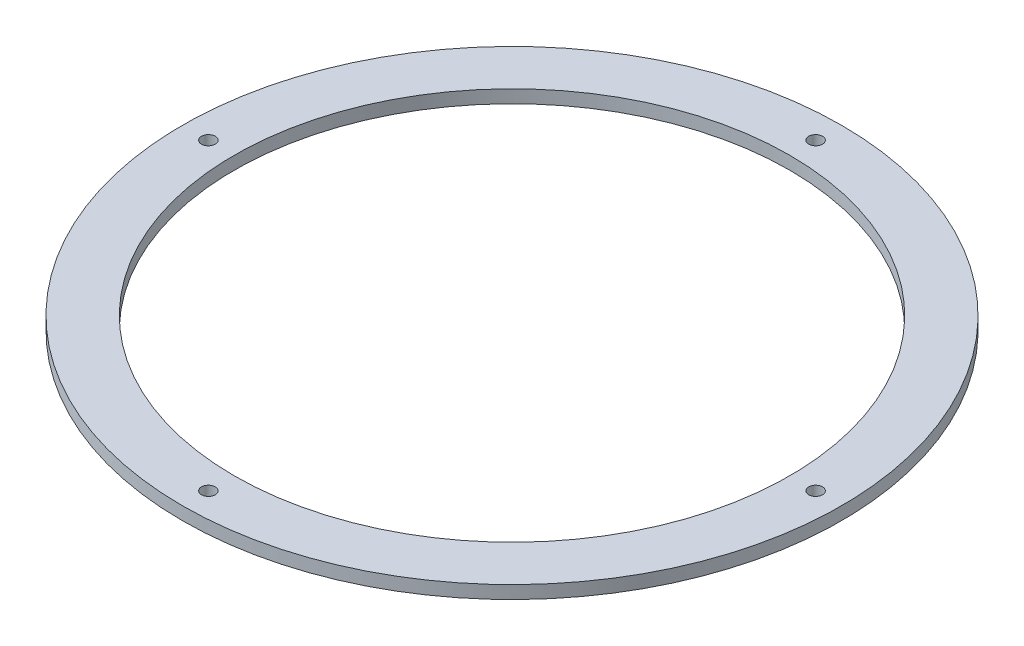
ISO-10303-21;
HEADER;
FILE_DESCRIPTION(('STEP AP214'),'2;1');
FILE_NAME('part.step','',(''),(''),'','','');
FILE_SCHEMA(('AUTOMOTIVE_DESIGN { 1 0 10303 214 1 1 1 1 }'));
ENDSEC;
DATA;
#1=APPLICATION_CONTEXT('core data for automotive mechanical design processes');
#2=APPLICATION_PROTOCOL_DEFINITION('international standard','automotive_design',2000,#1);
#3=PRODUCT_CONTEXT('',#1,'mechanical');
#4=PRODUCT('Part','Part','',(#3));
#5=PRODUCT_RELATED_PRODUCT_CATEGORY('part','',(#4));
#6=PRODUCT_DEFINITION_FORMATION('','',#4);
#7=PRODUCT_DEFINITION_CONTEXT('part definition',#1,'design');
#8=PRODUCT_DEFINITION('design','',#6,#7);
#9=PRODUCT_DEFINITION_SHAPE('','',#8);
#10=(LENGTH_UNIT() NAMED_UNIT(*) SI_UNIT(.MILLI.,.METRE.));
#11=(NAMED_UNIT(*) PLANE_ANGLE_UNIT() SI_UNIT($,.RADIAN.));
#12=(NAMED_UNIT(*) SI_UNIT($,.STERADIAN.) SOLID_ANGLE_UNIT());
#13=UNCERTAINTY_MEASURE_WITH_UNIT(LENGTH_MEASURE(1.E-05),#10,'distance_accuracy_value','');
#14=(GEOMETRIC_REPRESENTATION_CONTEXT(3) GLOBAL_UNCERTAINTY_ASSIGNED_CONTEXT((#13)) GLOBAL_UNIT_ASSIGNED_CONTEXT((#10,
#11,#12)) REPRESENTATION_CONTEXT('',''));
#15=CARTESIAN_POINT('',(0.,0.,0.));
#16=DIRECTION('',(0.,0.,1.));
#17=DIRECTION('',(1.,0.,0.));
#18=AXIS2_PLACEMENT_3D('',#15,#16,#17);
#19=CARTESIAN_POINT('',(0.,6.35,0.));
#20=DIRECTION('',(0.,1.,0.));
#21=DIRECTION('',(0.,0.,1.));
#22=AXIS2_PLACEMENT_3D('',#19,#20,#21);
#23=PLANE('',#22);
#24=CARTESIAN_POINT('',(-148.7,6.35,1.57576032316124E-12));
#25=DIRECTION('',(0.,1.,0.));
#26=DIRECTION('',(0.,0.,1.));
#27=AXIS2_PLACEMENT_3D('',#24,#25,#26);
#28=CIRCLE('',#27,3.3782);
#29=CARTESIAN_POINT('',(-148.7,6.35,3.37820000000157));
#30=VERTEX_POINT('',#29);
#31=EDGE_CURVE('E76',#30,#30,#28,.T.);
#32=ORIENTED_EDGE('',*,*,#31,.F.);
#33=EDGE_LOOP('',(#32));
#34=FACE_BOUND('',#33,.T.);
#35=CARTESIAN_POINT('',(0.,6.35,-148.7));
#36=DIRECTION('',(0.,1.,0.));
#37=DIRECTION('',(0.,0.,1.));
#38=AXIS2_PLACEMENT_3D('',#35,#36,#37);
#39=CIRCLE('',#38,3.37819999999999);
#40=CARTESIAN_POINT('',(0.,6.35,-145.3218));
#41=VERTEX_POINT('',#40);
#42=EDGE_CURVE('E70',#41,#41,#39,.T.);
#43=ORIENTED_EDGE('',*,*,#42,.F.);
#44=EDGE_LOOP('',(#43));
#45=FACE_BOUND('',#44,.T.);
#46=CARTESIAN_POINT('',(148.7,6.35,-5.37393772989295E-13));
#47=DIRECTION('',(0.,1.,0.));
#48=DIRECTION('',(0.,0.,1.));
#49=AXIS2_PLACEMENT_3D('',#46,#47,#48);
#50=CIRCLE('',#49,3.3782);
#51=CARTESIAN_POINT('',(148.7,6.35,3.37819999999946));
#52=VERTEX_POINT('',#51);
#53=EDGE_CURVE('E64',#52,#52,#50,.T.);
#54=ORIENTED_EDGE('',*,*,#53,.F.);
#55=EDGE_LOOP('',(#54));
#56=FACE_BOUND('',#55,.T.);
#57=CARTESIAN_POINT('',(0.,6.35,148.7));
#58=DIRECTION('',(0.,1.,0.));
#59=DIRECTION('',(0.,0.,1.));
#60=AXIS2_PLACEMENT_3D('',#57,#58,#59);
#61=CIRCLE('',#60,3.37819999999999);
#62=CARTESIAN_POINT('',(0.,6.35,152.0782));
#63=VERTEX_POINT('',#62);
#64=EDGE_CURVE('E58',#63,#63,#61,.T.);
#65=ORIENTED_EDGE('',*,*,#64,.F.);
#66=EDGE_LOOP('',(#65));
#67=FACE_BOUND('',#66,.T.);
#68=CARTESIAN_POINT('',(0.,6.35,0.));
#69=DIRECTION('',(0.,1.,0.));
#70=DIRECTION('',(0.,0.,1.));
#71=AXIS2_PLACEMENT_3D('',#68,#69,#70);
#72=CIRCLE('',#71,161.4);
#73=CARTESIAN_POINT('',(0.,6.35,161.4));
#74=VERTEX_POINT('',#73);
#75=EDGE_CURVE('E10',#74,#74,#72,.T.);
#76=ORIENTED_EDGE('',*,*,#75,.T.);
#77=EDGE_LOOP('',(#76));
#78=FACE_BOUND('',#77,.T.);
#79=CARTESIAN_POINT('',(0.,6.35,0.));
#80=DIRECTION('',(0.,1.,0.));
#81=DIRECTION('',(0.,0.,1.));
#82=AXIS2_PLACEMENT_3D('',#79,#80,#81);
#83=CIRCLE('',#82,136.);
#84=CARTESIAN_POINT('',(0.,6.35,136.));
#85=VERTEX_POINT('',#84);
#86=EDGE_CURVE('E48',#85,#85,#83,.T.);
#87=ORIENTED_EDGE('',*,*,#86,.F.);
#88=EDGE_LOOP('',(#87));
#89=FACE_BOUND('',#88,.T.);
#90=ADVANCED_FACE('F37',(#34,#45,#56,#67,#78,#89),#23,.T.);
#91=CARTESIAN_POINT('',(0.,0.,0.));
#92=DIRECTION('',(0.,1.,0.));
#93=DIRECTION('',(0.,0.,1.));
#94=AXIS2_PLACEMENT_3D('',#91,#92,#93);
#95=PLANE('',#94);
#96=CARTESIAN_POINT('',(-148.7,0.,1.57576032316124E-12));
#97=DIRECTION('',(0.,1.,0.));
#98=DIRECTION('',(0.,0.,1.));
#99=AXIS2_PLACEMENT_3D('',#96,#97,#98);
#100=CIRCLE('',#99,3.3782);
#101=CARTESIAN_POINT('',(-148.7,0.,3.37820000000157));
#102=VERTEX_POINT('',#101);
#103=EDGE_CURVE('E73',#102,#102,#100,.T.);
#104=ORIENTED_EDGE('',*,*,#103,.T.);
#105=EDGE_LOOP('',(#104));
#106=FACE_BOUND('',#105,.T.);
#107=CARTESIAN_POINT('',(0.,0.,-148.7));
#108=DIRECTION('',(0.,1.,0.));
#109=DIRECTION('',(0.,0.,1.));
#110=AXIS2_PLACEMENT_3D('',#107,#108,#109);
#111=CIRCLE('',#110,3.3782);
#112=CARTESIAN_POINT('',(0.,0.,-145.3218));
#113=VERTEX_POINT('',#112);
#114=EDGE_CURVE('E67',#113,#113,#111,.T.);
#115=ORIENTED_EDGE('',*,*,#114,.T.);
#116=EDGE_LOOP('',(#115));
#117=FACE_BOUND('',#116,.T.);
#118=CARTESIAN_POINT('',(148.7,0.,-5.37393772989295E-13));
#119=DIRECTION('',(0.,1.,0.));
#120=DIRECTION('',(0.,0.,1.));
#121=AXIS2_PLACEMENT_3D('',#118,#119,#120);
#122=CIRCLE('',#121,3.3782);
#123=CARTESIAN_POINT('',(148.7,0.,3.37819999999946));
#124=VERTEX_POINT('',#123);
#125=EDGE_CURVE('E61',#124,#124,#122,.T.);
#126=ORIENTED_EDGE('',*,*,#125,.T.);
#127=EDGE_LOOP('',(#126));
#128=FACE_BOUND('',#127,.T.);
#129=CARTESIAN_POINT('',(0.,0.,148.7));
#130=DIRECTION('',(0.,1.,0.));
#131=DIRECTION('',(0.,0.,1.));
#132=AXIS2_PLACEMENT_3D('',#129,#130,#131);
#133=CIRCLE('',#132,3.3782);
#134=CARTESIAN_POINT('',(0.,0.,152.0782));
#135=VERTEX_POINT('',#134);
#136=EDGE_CURVE('E53',#135,#135,#133,.T.);
#137=ORIENTED_EDGE('',*,*,#136,.T.);
#138=EDGE_LOOP('',(#137));
#139=FACE_BOUND('',#138,.T.);
#140=CARTESIAN_POINT('',(0.,0.,0.));
#141=DIRECTION('',(0.,1.,0.));
#142=DIRECTION('',(0.,0.,1.));
#143=AXIS2_PLACEMENT_3D('',#140,#141,#142);
#144=CIRCLE('',#143,161.4);
#145=CARTESIAN_POINT('',(0.,0.,161.4));
#146=VERTEX_POINT('',#145);
#147=EDGE_CURVE('E41',#146,#146,#144,.T.);
#148=ORIENTED_EDGE('',*,*,#147,.F.);
#149=EDGE_LOOP('',(#148));
#150=FACE_BOUND('',#149,.T.);
#151=CARTESIAN_POINT('',(0.,0.,0.));
#152=DIRECTION('',(0.,1.,0.));
#153=DIRECTION('',(0.,0.,1.));
#154=AXIS2_PLACEMENT_3D('',#151,#152,#153);
#155=CIRCLE('',#154,136.);
#156=CARTESIAN_POINT('',(0.,0.,136.));
#157=VERTEX_POINT('',#156);
#158=EDGE_CURVE('E50',#157,#157,#155,.T.);
#159=ORIENTED_EDGE('',*,*,#158,.T.);
#160=EDGE_LOOP('',(#159));
#161=FACE_BOUND('',#160,.T.);
#162=ADVANCED_FACE('F84',(#106,#117,#128,#139,#150,#161),#95,.F.);
#163=CARTESIAN_POINT('',(0.,6.35,0.));
#164=DIRECTION('',(0.,-1.,0.));
#165=DIRECTION('',(0.,0.,-1.));
#166=AXIS2_PLACEMENT_3D('',#163,#164,#165);
#167=CYLINDRICAL_SURFACE('',#166,161.4);
#168=ORIENTED_EDGE('',*,*,#75,.F.);
#169=EDGE_LOOP('',(#168));
#170=FACE_BOUND('',#169,.T.);
#171=ORIENTED_EDGE('',*,*,#147,.T.);
#172=EDGE_LOOP('',(#171));
#173=FACE_BOUND('',#172,.T.);
#174=ADVANCED_FACE('F39',(#170,#173),#167,.T.);
#175=CARTESIAN_POINT('',(0.,6.35,0.));
#176=DIRECTION('',(0.,-1.,0.));
#177=DIRECTION('',(0.,0.,-1.));
#178=AXIS2_PLACEMENT_3D('',#175,#176,#177);
#179=CYLINDRICAL_SURFACE('',#178,136.);
#180=ORIENTED_EDGE('',*,*,#86,.T.);
#181=EDGE_LOOP('',(#180));
#182=FACE_BOUND('',#181,.T.);
#183=ORIENTED_EDGE('',*,*,#158,.F.);
#184=EDGE_LOOP('',(#183));
#185=FACE_BOUND('',#184,.T.);
#186=ADVANCED_FACE('F94',(#182,#185),#179,.F.);
#187=CARTESIAN_POINT('',(0.,6.35,148.7));
#188=DIRECTION('',(0.,1.,0.));
#189=DIRECTION('',(0.,0.,1.));
#190=AXIS2_PLACEMENT_3D('',#187,#188,#189);
#191=CYLINDRICAL_SURFACE('',#190,3.37819999999999);
#192=ORIENTED_EDGE('',*,*,#136,.F.);
#193=EDGE_LOOP('',(#192));
#194=FACE_BOUND('',#193,.T.);
#195=ORIENTED_EDGE('',*,*,#64,.T.);
#196=EDGE_LOOP('',(#195));
#197=FACE_BOUND('',#196,.T.);
#198=ADVANCED_FACE('F97',(#194,#197),#191,.F.);
#199=CARTESIAN_POINT('',(148.7,6.35,-5.37393772989295E-13));
#200=DIRECTION('',(0.,1.,0.));
#201=DIRECTION('',(0.,0.,1.));
#202=AXIS2_PLACEMENT_3D('',#199,#200,#201);
#203=CYLINDRICAL_SURFACE('',#202,3.3782);
#204=ORIENTED_EDGE('',*,*,#125,.F.);
#205=EDGE_LOOP('',(#204));
#206=FACE_BOUND('',#205,.T.);
#207=ORIENTED_EDGE('',*,*,#53,.T.);
#208=EDGE_LOOP('',(#207));
#209=FACE_BOUND('',#208,.T.);
#210=ADVANCED_FACE('F112',(#206,#209),#203,.F.);
#211=CARTESIAN_POINT('',(0.,6.35,-148.7));
#212=DIRECTION('',(0.,1.,0.));
#213=DIRECTION('',(0.,0.,1.));
#214=AXIS2_PLACEMENT_3D('',#211,#212,#213);
#215=CYLINDRICAL_SURFACE('',#214,3.37819999999999);
#216=ORIENTED_EDGE('',*,*,#114,.F.);
#217=EDGE_LOOP('',(#216));
#218=FACE_BOUND('',#217,.T.);
#219=ORIENTED_EDGE('',*,*,#42,.T.);
#220=EDGE_LOOP('',(#219));
#221=FACE_BOUND('',#220,.T.);
#222=ADVANCED_FACE('F115',(#218,#221),#215,.F.);
#223=CARTESIAN_POINT('',(-148.7,6.35,1.57576032316124E-12));
#224=DIRECTION('',(0.,1.,0.));
#225=DIRECTION('',(0.,0.,1.));
#226=AXIS2_PLACEMENT_3D('',#223,#224,#225);
#227=CYLINDRICAL_SURFACE('',#226,3.3782);
#228=ORIENTED_EDGE('',*,*,#103,.F.);
#229=EDGE_LOOP('',(#228));
#230=FACE_BOUND('',#229,.T.);
#231=ORIENTED_EDGE('',*,*,#31,.T.);
#232=EDGE_LOOP('',(#231));
#233=FACE_BOUND('',#232,.T.);
#234=ADVANCED_FACE('F80',(#230,#233),#227,.F.);
#235=CLOSED_SHELL('',(#90,#162,#174,#186,#198,#210,#222,#234));
#236=MANIFOLD_SOLID_BREP('B2',#235);
#237=ADVANCED_BREP_SHAPE_REPRESENTATION('',(#18,#236),#14);
#238=SHAPE_DEFINITION_REPRESENTATION(#9,#237);
ENDSEC;
END-ISO-10303-21;
